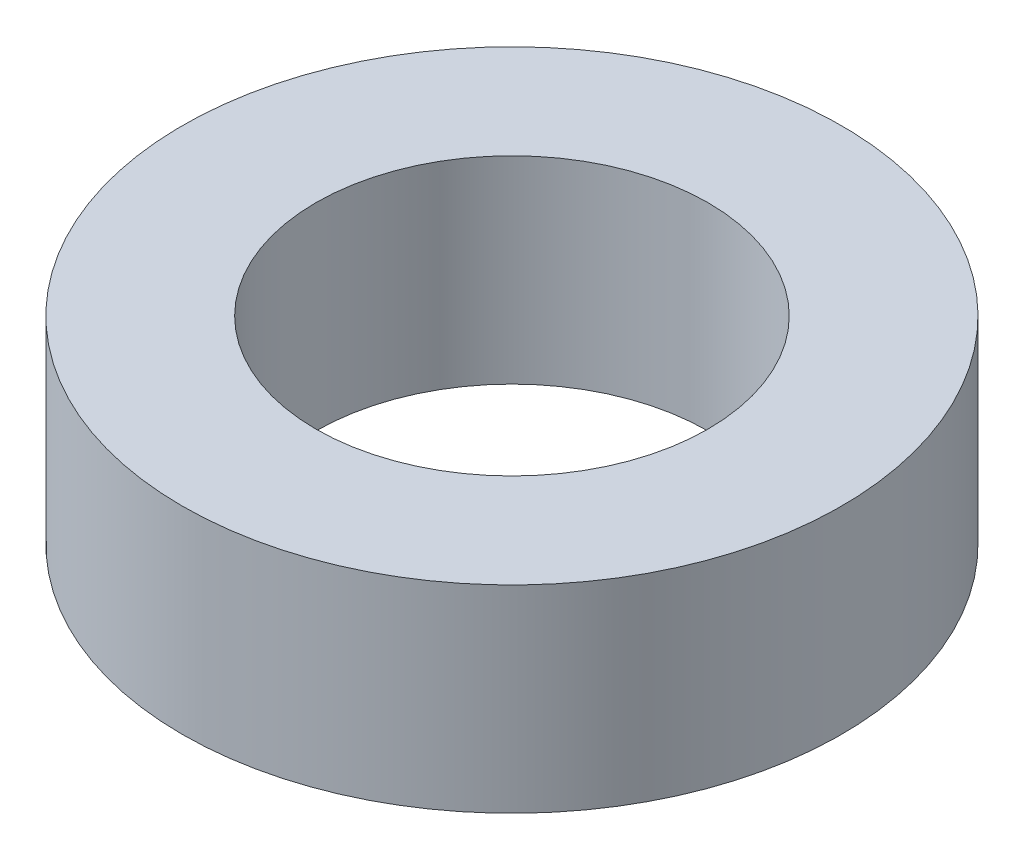
ISO-10303-21;
HEADER;
FILE_DESCRIPTION(('STEP AP214'),'2;1');
FILE_NAME('part.step','',(''),(''),'','','');
FILE_SCHEMA(('AUTOMOTIVE_DESIGN { 1 0 10303 214 1 1 1 1 }'));
ENDSEC;
DATA;
#1=APPLICATION_CONTEXT('core data for automotive mechanical design processes');
#2=APPLICATION_PROTOCOL_DEFINITION('international standard','automotive_design',2000,#1);
#3=PRODUCT_CONTEXT('',#1,'mechanical');
#4=PRODUCT('Part','Part','',(#3));
#5=PRODUCT_RELATED_PRODUCT_CATEGORY('part','',(#4));
#6=PRODUCT_DEFINITION_FORMATION('','',#4);
#7=PRODUCT_DEFINITION_CONTEXT('part definition',#1,'design');
#8=PRODUCT_DEFINITION('design','',#6,#7);
#9=PRODUCT_DEFINITION_SHAPE('','',#8);
#10=(LENGTH_UNIT() NAMED_UNIT(*) SI_UNIT(.MILLI.,.METRE.));
#11=(NAMED_UNIT(*) PLANE_ANGLE_UNIT() SI_UNIT($,.RADIAN.));
#12=(NAMED_UNIT(*) SI_UNIT($,.STERADIAN.) SOLID_ANGLE_UNIT());
#13=UNCERTAINTY_MEASURE_WITH_UNIT(LENGTH_MEASURE(1.E-05),#10,'distance_accuracy_value','');
#14=(GEOMETRIC_REPRESENTATION_CONTEXT(3) GLOBAL_UNCERTAINTY_ASSIGNED_CONTEXT((#13)) GLOBAL_UNIT_ASSIGNED_CONTEXT((#10,
#11,#12)) REPRESENTATION_CONTEXT('',''));
#15=CARTESIAN_POINT('',(0.,0.,0.));
#16=DIRECTION('',(0.,0.,1.));
#17=DIRECTION('',(1.,0.,0.));
#18=AXIS2_PLACEMENT_3D('',#15,#16,#17);
#19=CARTESIAN_POINT('',(0.,3.,5.95));
#20=DIRECTION('',(0.,1.,0.));
#21=DIRECTION('',(0.,0.,1.));
#22=AXIS2_PLACEMENT_3D('',#19,#20,#21);
#23=PLANE('',#22);
#24=CARTESIAN_POINT('',(0.,3.,0.));
#25=DIRECTION('',(0.,1.,0.));
#26=DIRECTION('',(0.,0.,1.));
#27=AXIS2_PLACEMENT_3D('',#24,#25,#26);
#28=CIRCLE('',#27,10.);
#29=CARTESIAN_POINT('',(0.,3.,10.));
#30=VERTEX_POINT('',#29);
#31=EDGE_CURVE('E10',#30,#30,#28,.T.);
#32=ORIENTED_EDGE('',*,*,#31,.T.);
#33=EDGE_LOOP('',(#32));
#34=FACE_BOUND('',#33,.T.);
#35=CARTESIAN_POINT('',(0.,3.,0.));
#36=DIRECTION('',(0.,1.,0.));
#37=DIRECTION('',(0.,0.,1.));
#38=AXIS2_PLACEMENT_3D('',#35,#36,#37);
#39=CIRCLE('',#38,5.95);
#40=CARTESIAN_POINT('',(0.,3.,5.95));
#41=VERTEX_POINT('',#40);
#42=EDGE_CURVE('E45',#41,#41,#39,.T.);
#43=ORIENTED_EDGE('',*,*,#42,.F.);
#44=EDGE_LOOP('',(#43));
#45=FACE_BOUND('',#44,.T.);
#46=ADVANCED_FACE('F31',(#34,#45),#23,.T.);
#47=CARTESIAN_POINT('',(0.,16.2573099415205,0.));
#48=DIRECTION('',(0.,1.,0.));
#49=DIRECTION('',(0.,0.,1.));
#50=AXIS2_PLACEMENT_3D('',#47,#48,#49);
#51=CYLINDRICAL_SURFACE('',#50,10.);
#52=CARTESIAN_POINT('',(0.,-3.,0.));
#53=DIRECTION('',(0.,1.,0.));
#54=DIRECTION('',(0.,0.,1.));
#55=AXIS2_PLACEMENT_3D('',#52,#53,#54);
#56=CIRCLE('',#55,10.);
#57=CARTESIAN_POINT('',(0.,-3.,10.));
#58=VERTEX_POINT('',#57);
#59=EDGE_CURVE('E37',#58,#58,#56,.T.);
#60=ORIENTED_EDGE('',*,*,#59,.T.);
#61=EDGE_LOOP('',(#60));
#62=FACE_BOUND('',#61,.T.);
#63=ORIENTED_EDGE('',*,*,#31,.F.);
#64=EDGE_LOOP('',(#63));
#65=FACE_BOUND('',#64,.T.);
#66=ADVANCED_FACE('F55',(#62,#65),#51,.T.);
#67=CARTESIAN_POINT('',(0.,-3.,10.));
#68=DIRECTION('',(0.,-1.,0.));
#69=DIRECTION('',(0.,0.,-1.));
#70=AXIS2_PLACEMENT_3D('',#67,#68,#69);
#71=PLANE('',#70);
#72=CARTESIAN_POINT('',(0.,-3.,0.));
#73=DIRECTION('',(0.,1.,0.));
#74=DIRECTION('',(0.,0.,1.));
#75=AXIS2_PLACEMENT_3D('',#72,#73,#74);
#76=CIRCLE('',#75,5.95);
#77=CARTESIAN_POINT('',(0.,-3.,5.95));
#78=VERTEX_POINT('',#77);
#79=EDGE_CURVE('E41',#78,#78,#76,.T.);
#80=ORIENTED_EDGE('',*,*,#79,.T.);
#81=EDGE_LOOP('',(#80));
#82=FACE_BOUND('',#81,.T.);
#83=ORIENTED_EDGE('',*,*,#59,.F.);
#84=EDGE_LOOP('',(#83));
#85=FACE_BOUND('',#84,.T.);
#86=ADVANCED_FACE('F59',(#82,#85),#71,.T.);
#87=CARTESIAN_POINT('',(0.,16.2573099415205,0.));
#88=DIRECTION('',(0.,1.,0.));
#89=DIRECTION('',(0.,0.,1.));
#90=AXIS2_PLACEMENT_3D('',#87,#88,#89);
#91=CYLINDRICAL_SURFACE('',#90,5.95);
#92=ORIENTED_EDGE('',*,*,#42,.T.);
#93=EDGE_LOOP('',(#92));
#94=FACE_BOUND('',#93,.T.);
#95=ORIENTED_EDGE('',*,*,#79,.F.);
#96=EDGE_LOOP('',(#95));
#97=FACE_BOUND('',#96,.T.);
#98=ADVANCED_FACE('F51',(#94,#97),#91,.F.);
#99=CLOSED_SHELL('',(#46,#66,#86,#98));
#100=MANIFOLD_SOLID_BREP('B2',#99);
#101=ADVANCED_BREP_SHAPE_REPRESENTATION('',(#18,#100),#14);
#102=SHAPE_DEFINITION_REPRESENTATION(#9,#101);
ENDSEC;
END-ISO-10303-21;
